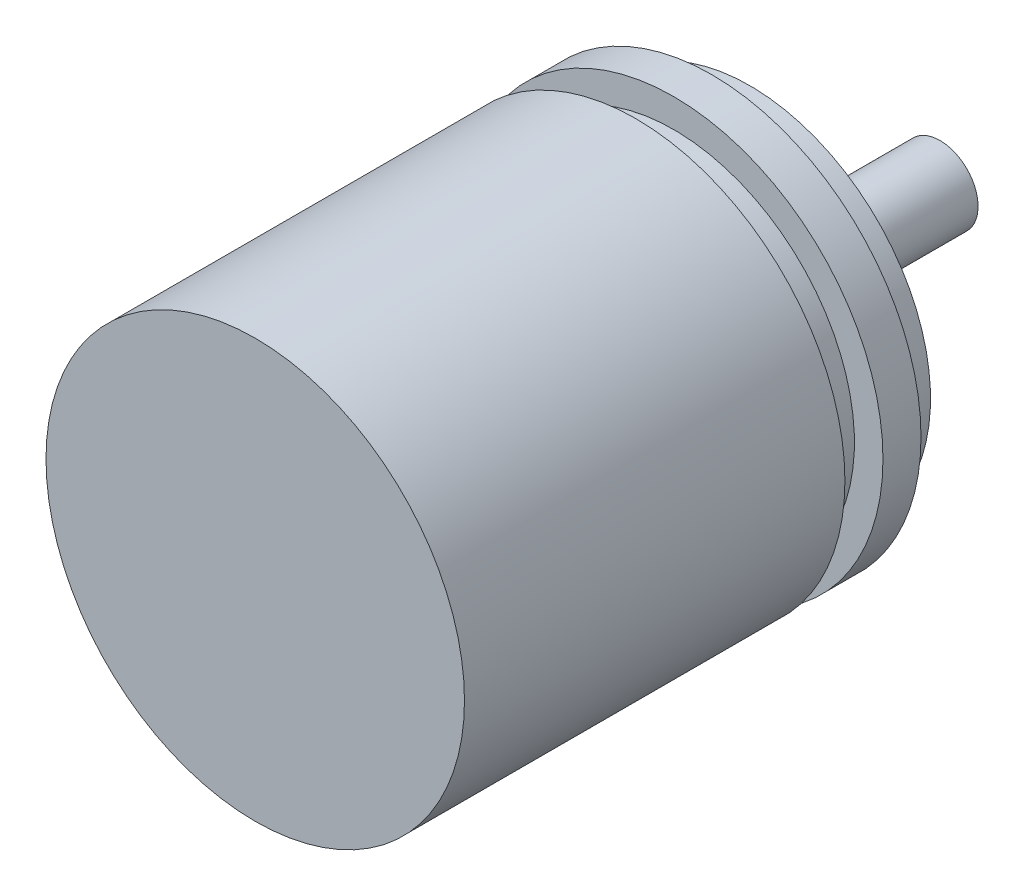
ISO-10303-21;
HEADER;
FILE_DESCRIPTION(('STEP AP214'),'2;1');
FILE_NAME('part.step','',(''),(''),'','','');
FILE_SCHEMA(('AUTOMOTIVE_DESIGN { 1 0 10303 214 1 1 1 1 }'));
ENDSEC;
DATA;
#1=APPLICATION_CONTEXT('core data for automotive mechanical design processes');
#2=APPLICATION_PROTOCOL_DEFINITION('international standard','automotive_design',2000,#1);
#3=PRODUCT_CONTEXT('',#1,'mechanical');
#4=PRODUCT('Part','Part','',(#3));
#5=PRODUCT_RELATED_PRODUCT_CATEGORY('part','',(#4));
#6=PRODUCT_DEFINITION_FORMATION('','',#4);
#7=PRODUCT_DEFINITION_CONTEXT('part definition',#1,'design');
#8=PRODUCT_DEFINITION('design','',#6,#7);
#9=PRODUCT_DEFINITION_SHAPE('','',#8);
#10=(LENGTH_UNIT() NAMED_UNIT(*) SI_UNIT(.MILLI.,.METRE.));
#11=(NAMED_UNIT(*) PLANE_ANGLE_UNIT() SI_UNIT($,.RADIAN.));
#12=(NAMED_UNIT(*) SI_UNIT($,.STERADIAN.) SOLID_ANGLE_UNIT());
#13=UNCERTAINTY_MEASURE_WITH_UNIT(LENGTH_MEASURE(1.E-05),#10,'distance_accuracy_value','');
#14=(GEOMETRIC_REPRESENTATION_CONTEXT(3) GLOBAL_UNCERTAINTY_ASSIGNED_CONTEXT((#13)) GLOBAL_UNIT_ASSIGNED_CONTEXT((#10,
#11,#12)) REPRESENTATION_CONTEXT('',''));
#15=CARTESIAN_POINT('',(0.,0.,0.));
#16=DIRECTION('',(0.,0.,1.));
#17=DIRECTION('',(1.,0.,0.));
#18=AXIS2_PLACEMENT_3D('',#15,#16,#17);
#19=CARTESIAN_POINT('',(0.,3.67761376907083E-13,13.9999999999999));
#20=DIRECTION('',(0.,0.,0.999999999999979));
#21=DIRECTION('',(1.,0.,0.));
#22=AXIS2_PLACEMENT_3D('',#19,#20,#21);
#23=PLANE('',#22);
#24=CARTESIAN_POINT('',(0.,3.67761376907083E-13,13.9999999999999));
#25=DIRECTION('',(0.,0.,0.999999999999979));
#26=DIRECTION('',(1.,0.,0.));
#27=AXIS2_PLACEMENT_3D('',#24,#25,#26);
#28=CIRCLE('',#27,11.);
#29=CARTESIAN_POINT('',(-11.,3.67761376907083E-13,13.9999999999999));
#30=VERTEX_POINT('',#29);
#31=EDGE_CURVE('E46',#30,#30,#28,.T.);
#32=ORIENTED_EDGE('',*,*,#31,.T.);
#33=EDGE_LOOP('',(#32));
#34=FACE_BOUND('',#33,.T.);
#35=CARTESIAN_POINT('',(0.,3.67761376907083E-13,13.9999999999999));
#36=DIRECTION('',(0.,0.,0.999999999999979));
#37=DIRECTION('',(1.,0.,0.));
#38=AXIS2_PLACEMENT_3D('',#35,#36,#37);
#39=CIRCLE('',#38,9.5);
#40=CARTESIAN_POINT('',(-9.5,3.81639164714898E-13,13.9999999999999));
#41=VERTEX_POINT('',#40);
#42=EDGE_CURVE('E55',#41,#41,#39,.T.);
#43=ORIENTED_EDGE('',*,*,#42,.F.);
#44=EDGE_LOOP('',(#43));
#45=FACE_BOUND('',#44,.T.);
#46=ADVANCED_FACE('F30',(#34,#45),#23,.T.);
#47=CARTESIAN_POINT('',(-6.66133814775094E-13,0.,9.99999999999991));
#48=DIRECTION('',(0.,0.,-0.999999999999979));
#49=DIRECTION('',(-1.,0.,0.));
#50=AXIS2_PLACEMENT_3D('',#47,#48,#49);
#51=CYLINDRICAL_SURFACE('',#50,2.);
#52=CARTESIAN_POINT('',(-6.66133814775094E-13,0.,9.99999999999991));
#53=DIRECTION('',(0.,0.,0.999999999999979));
#54=DIRECTION('',(1.,0.,0.));
#55=AXIS2_PLACEMENT_3D('',#52,#53,#54);
#56=CIRCLE('',#55,2.);
#57=CARTESIAN_POINT('',(-2.00000000000067,0.,9.99999999999991));
#58=VERTEX_POINT('',#57);
#59=EDGE_CURVE('E10',#58,#58,#56,.T.);
#60=CARTESIAN_POINT('',(0.,0.,0.));
#61=DIRECTION('',(0.,0.,0.999999999999979));
#62=DIRECTION('',(1.,0.,0.));
#63=AXIS2_PLACEMENT_3D('',#60,#61,#62);
#64=CIRCLE('',#63,2.);
#65=CARTESIAN_POINT('',(-2.00000000000067,0.,0.));
#66=VERTEX_POINT('',#65);
#67=EDGE_CURVE('E34',#66,#66,#64,.T.);
#68=CARTESIAN_POINT('',(-2.00000000000067,0.,9.99999999999991));
#69=CARTESIAN_POINT('',(-2.00000000000067,0.,9.89583333333325));
#70=CARTESIAN_POINT('',(-2.00000000000067,0.,9.79166666666658));
#71=CARTESIAN_POINT('',(-2.00000000000067,0.,9.58333333333325));
#72=CARTESIAN_POINT('',(-2.00000000000067,0.,9.47916666666658));
#73=CARTESIAN_POINT('',(-2.00000000000067,0.,9.27083333333325));
#74=CARTESIAN_POINT('',(-2.00000000000067,0.,9.16666666666658));
#75=CARTESIAN_POINT('',(-2.00000000000067,0.,8.95833333333325));
#76=CARTESIAN_POINT('',(-2.00000000000067,0.,8.85416666666659));
#77=CARTESIAN_POINT('',(-2.00000000000067,0.,8.64583333333326));
#78=CARTESIAN_POINT('',(-2.00000000000067,0.,8.54166666666659));
#79=CARTESIAN_POINT('',(-2.00000000000067,0.,8.33333333333326));
#80=CARTESIAN_POINT('',(-2.00000000000067,0.,8.22916666666659));
#81=CARTESIAN_POINT('',(-2.00000000000067,0.,8.02083333333326));
#82=CARTESIAN_POINT('',(-2.00000000000067,0.,7.9166666666666));
#83=CARTESIAN_POINT('',(-2.00000000000067,0.,7.70833333333326));
#84=CARTESIAN_POINT('',(-2.00000000000067,0.,7.6041666666666));
#85=CARTESIAN_POINT('',(-2.00000000000067,0.,7.39583333333327));
#86=CARTESIAN_POINT('',(-2.00000000000067,0.,7.2916666666666));
#87=CARTESIAN_POINT('',(-2.00000000000067,0.,7.08333333333327));
#88=CARTESIAN_POINT('',(-2.00000000000067,0.,6.9791666666666));
#89=CARTESIAN_POINT('',(-2.00000000000067,0.,6.77083333333327));
#90=CARTESIAN_POINT('',(-2.00000000000067,0.,6.66666666666661));
#91=CARTESIAN_POINT('',(-2.00000000000067,0.,6.45833333333328));
#92=CARTESIAN_POINT('',(-2.00000000000067,0.,6.35416666666661));
#93=CARTESIAN_POINT('',(-2.00000000000067,0.,6.14583333333328));
#94=CARTESIAN_POINT('',(-2.00000000000067,0.,6.04166666666661));
#95=CARTESIAN_POINT('',(-2.00000000000067,0.,5.83333333333328));
#96=CARTESIAN_POINT('',(-2.00000000000067,0.,5.72916666666662));
#97=CARTESIAN_POINT('',(-2.00000000000067,0.,5.52083333333329));
#98=CARTESIAN_POINT('',(-2.00000000000067,0.,5.41666666666662));
#99=CARTESIAN_POINT('',(-2.00000000000067,0.,5.20833333333329));
#100=CARTESIAN_POINT('',(-2.00000000000067,0.,5.10416666666662));
#101=CARTESIAN_POINT('',(-2.00000000000067,0.,4.89583333333329));
#102=CARTESIAN_POINT('',(-2.00000000000067,0.,4.79166666666662));
#103=CARTESIAN_POINT('',(-2.00000000000067,0.,4.58333333333329));
#104=CARTESIAN_POINT('',(-2.00000000000067,0.,4.47916666666663));
#105=CARTESIAN_POINT('',(-2.00000000000067,0.,4.2708333333333));
#106=CARTESIAN_POINT('',(-2.00000000000067,0.,4.16666666666663));
#107=CARTESIAN_POINT('',(-2.00000000000067,0.,3.9583333333333));
#108=CARTESIAN_POINT('',(-2.00000000000067,0.,3.85416666666663));
#109=CARTESIAN_POINT('',(-2.00000000000067,0.,3.6458333333333));
#110=CARTESIAN_POINT('',(-2.00000000000067,0.,3.54166666666664));
#111=CARTESIAN_POINT('',(-2.00000000000067,0.,3.3333333333333));
#112=CARTESIAN_POINT('',(-2.00000000000067,0.,3.22916666666664));
#113=CARTESIAN_POINT('',(-2.00000000000067,0.,3.02083333333331));
#114=CARTESIAN_POINT('',(-2.00000000000067,0.,2.91666666666664));
#115=CARTESIAN_POINT('',(-2.00000000000067,0.,2.70833333333331));
#116=CARTESIAN_POINT('',(-2.00000000000067,0.,2.60416666666664));
#117=CARTESIAN_POINT('',(-2.00000000000067,0.,2.39583333333331));
#118=CARTESIAN_POINT('',(-2.00000000000067,0.,2.29166666666665));
#119=CARTESIAN_POINT('',(-2.00000000000067,0.,2.08333333333332));
#120=CARTESIAN_POINT('',(-2.00000000000067,0.,1.97916666666665));
#121=CARTESIAN_POINT('',(-2.00000000000067,0.,1.77083333333332));
#122=CARTESIAN_POINT('',(-2.00000000000067,0.,1.66666666666665));
#123=CARTESIAN_POINT('',(-2.00000000000067,0.,1.45833333333332));
#124=CARTESIAN_POINT('',(-2.00000000000067,0.,1.35416666666666));
#125=CARTESIAN_POINT('',(-2.00000000000067,0.,1.14583333333332));
#126=CARTESIAN_POINT('',(-2.00000000000067,0.,1.04166666666666));
#127=CARTESIAN_POINT('',(-2.00000000000067,0.,0.833333333333327));
#128=CARTESIAN_POINT('',(-2.00000000000067,0.,0.729166666666661));
#129=CARTESIAN_POINT('',(-2.00000000000067,0.,0.52083333333333));
#130=CARTESIAN_POINT('',(-2.00000000000067,0.,0.416666666666664));
#131=CARTESIAN_POINT('',(-2.00000000000067,0.,0.208333333333332));
#132=CARTESIAN_POINT('',(-2.00000000000067,0.,0.104166666666666));
#133=CARTESIAN_POINT('',(-2.00000000000067,0.,0.));
#134=B_SPLINE_CURVE_WITH_KNOTS('',3,(#68,#69,#70,#71,#72,#73,#74,#75,#76,#77,#78,#79,#80,#81,
#82,#83,#84,#85,#86,#87,#88,#89,#90,#91,#92,#93,#94,#95,#96,#97,#98,#99,#100,#101,#102,#103,
#104,#105,#106,#107,#108,#109,#110,#111,#112,#113,#114,#115,#116,#117,#118,#119,#120,#121,#122,
#123,#124,#125,#126,#127,#128,#129,#130,#131,#132,#133),.UNSPECIFIED.,.F.,.F.,(4,2,2,2,2,2,2,2,
2,2,2,2,2,2,2,2,2,2,2,2,2,2,2,2,2,2,2,2,2,2,2,2,4),(0.,0.312499999999997,0.624999999999994,
0.93749999999999,1.24999999999999,1.56249999999999,1.87499999999998,2.18749999999998,
2.49999999999998,2.81249999999997,3.12499999999997,3.43749999999997,3.74999999999997,
4.06249999999996,4.37499999999996,4.68749999999996,4.99999999999995,5.31249999999995,
5.62499999999995,5.93749999999995,6.24999999999994,6.56249999999994,6.87499999999994,
7.18749999999993,7.49999999999993,7.81249999999993,8.12499999999993,8.43749999999992,
8.74999999999992,9.06249999999992,9.37499999999991,9.68749999999991,9.99999999999991),.UNSPECIFIED.);
#135=EDGE_CURVE('BSEAM32',#58,#66,#134,.T.);
#136=ORIENTED_EDGE('',*,*,#59,.F.);
#137=ORIENTED_EDGE('',*,*,#67,.T.);
#138=ORIENTED_EDGE('',*,*,#135,.T.);
#139=ORIENTED_EDGE('',*,*,#135,.F.);
#140=EDGE_LOOP('',(#136,#138,#137,#139));
#141=FACE_BOUND('',#140,.T.);
#142=ADVANCED_FACE('F32',(#141),#51,.T.);
#143=CARTESIAN_POINT('',(0.,0.,0.));
#144=DIRECTION('',(0.,0.,0.999999999999979));
#145=DIRECTION('',(1.,0.,0.));
#146=AXIS2_PLACEMENT_3D('',#143,#144,#145);
#147=PLANE('',#146);
#148=ORIENTED_EDGE('',*,*,#67,.F.);
#149=EDGE_LOOP('',(#148));
#150=FACE_BOUND('',#149,.T.);
#151=ADVANCED_FACE('F92',(#150),#147,.F.);
#152=CARTESIAN_POINT('',(-6.66133814775094E-13,0.,9.99999999999991));
#153=DIRECTION('',(0.,0.,0.999999999999979));
#154=DIRECTION('',(1.,0.,0.));
#155=AXIS2_PLACEMENT_3D('',#152,#153,#154);
#156=PLANE('',#155);
#157=CARTESIAN_POINT('',(-7.50000000000067,0.,9.99999999999991));
#158=DIRECTION('',(0.,0.,-0.999999999999979));
#159=DIRECTION('',(-1.,0.,0.));
#160=AXIS2_PLACEMENT_3D('',#157,#158,#159);
#161=CIRCLE('',#160,1.25);
#162=CARTESIAN_POINT('',(-8.75000000000001,0.,9.99999999999991));
#163=VERTEX_POINT('',#162);
#164=EDGE_CURVE('E73',#163,#163,#161,.T.);
#165=ORIENTED_EDGE('',*,*,#164,.F.);
#166=EDGE_LOOP('',(#165));
#167=FACE_BOUND('',#166,.T.);
#168=CARTESIAN_POINT('',(7.49999999999968,5.48172618408671E-13,9.99999999999994));
#169=DIRECTION('',(0.,0.,-0.999999999999979));
#170=DIRECTION('',(-1.,0.,0.));
#171=AXIS2_PLACEMENT_3D('',#168,#169,#170);
#172=CIRCLE('',#171,1.25);
#173=CARTESIAN_POINT('',(6.25000000000013,0.,9.99999999999994));
#174=VERTEX_POINT('',#173);
#175=EDGE_CURVE('E67',#174,#174,#172,.T.);
#176=ORIENTED_EDGE('',*,*,#175,.F.);
#177=EDGE_LOOP('',(#176));
#178=FACE_BOUND('',#177,.T.);
#179=CARTESIAN_POINT('',(-6.66133814775094E-13,0.,9.99999999999991));
#180=DIRECTION('',(0.,0.,0.999999999999979));
#181=DIRECTION('',(1.,0.,0.));
#182=AXIS2_PLACEMENT_3D('',#179,#180,#181);
#183=CIRCLE('',#182,9.5);
#184=CARTESIAN_POINT('',(-9.50000000000067,0.,9.99999999999991));
#185=VERTEX_POINT('',#184);
#186=EDGE_CURVE('E43',#185,#185,#183,.T.);
#187=ORIENTED_EDGE('',*,*,#186,.F.);
#188=EDGE_LOOP('',(#187));
#189=FACE_BOUND('',#188,.T.);
#190=ORIENTED_EDGE('',*,*,#59,.T.);
#191=EDGE_LOOP('',(#190));
#192=FACE_BOUND('',#191,.T.);
#193=ADVANCED_FACE('F88',(#167,#178,#189,#192),#156,.F.);
#194=CARTESIAN_POINT('',(-6.66133814775094E-13,0.,11.9999999999999));
#195=DIRECTION('',(0.,0.,-0.999999999999979));
#196=DIRECTION('',(-1.,0.,0.));
#197=AXIS2_PLACEMENT_3D('',#194,#195,#196);
#198=CYLINDRICAL_SURFACE('',#197,9.5);
#199=CARTESIAN_POINT('',(-6.66133814775094E-13,0.,11.9999999999999));
#200=DIRECTION('',(0.,0.,0.999999999999979));
#201=DIRECTION('',(1.,0.,0.));
#202=AXIS2_PLACEMENT_3D('',#199,#200,#201);
#203=CIRCLE('',#202,9.5);
#204=CARTESIAN_POINT('',(-9.50000000000067,0.,11.9999999999999));
#205=VERTEX_POINT('',#204);
#206=EDGE_CURVE('E41',#205,#205,#203,.T.);
#207=CARTESIAN_POINT('',(-9.50000000000067,0.,11.9999999999999));
#208=CARTESIAN_POINT('',(-9.50000000000067,0.,11.9791666666666));
#209=CARTESIAN_POINT('',(-9.50000000000067,0.,11.9583333333332));
#210=CARTESIAN_POINT('',(-9.50000000000067,0.,11.9166666666666));
#211=CARTESIAN_POINT('',(-9.50000000000067,0.,11.8958333333332));
#212=CARTESIAN_POINT('',(-9.50000000000067,0.,11.8541666666666));
#213=CARTESIAN_POINT('',(-9.50000000000067,0.,11.8333333333332));
#214=CARTESIAN_POINT('',(-9.50000000000067,0.,11.7916666666666));
#215=CARTESIAN_POINT('',(-9.50000000000067,0.,11.7708333333332));
#216=CARTESIAN_POINT('',(-9.50000000000067,0.,11.7291666666666));
#217=CARTESIAN_POINT('',(-9.50000000000067,0.,11.7083333333332));
#218=CARTESIAN_POINT('',(-9.50000000000067,0.,11.6666666666666));
#219=CARTESIAN_POINT('',(-9.50000000000067,0.,11.6458333333332));
#220=CARTESIAN_POINT('',(-9.50000000000067,0.,11.6041666666666));
#221=CARTESIAN_POINT('',(-9.50000000000067,0.,11.5833333333332));
#222=CARTESIAN_POINT('',(-9.50000000000067,0.,11.5416666666666));
#223=CARTESIAN_POINT('',(-9.50000000000067,0.,11.5208333333332));
#224=CARTESIAN_POINT('',(-9.50000000000067,0.,11.4791666666666));
#225=CARTESIAN_POINT('',(-9.50000000000067,0.,11.4583333333332));
#226=CARTESIAN_POINT('',(-9.50000000000067,0.,11.4166666666666));
#227=CARTESIAN_POINT('',(-9.50000000000067,0.,11.3958333333332));
#228=CARTESIAN_POINT('',(-9.50000000000067,0.,11.3541666666666));
#229=CARTESIAN_POINT('',(-9.50000000000067,0.,11.3333333333332));
#230=CARTESIAN_POINT('',(-9.50000000000067,0.,11.2916666666666));
#231=CARTESIAN_POINT('',(-9.50000000000067,0.,11.2708333333332));
#232=CARTESIAN_POINT('',(-9.50000000000067,0.,11.2291666666666));
#233=CARTESIAN_POINT('',(-9.50000000000067,0.,11.2083333333332));
#234=CARTESIAN_POINT('',(-9.50000000000067,0.,11.1666666666666));
#235=CARTESIAN_POINT('',(-9.50000000000067,0.,11.1458333333332));
#236=CARTESIAN_POINT('',(-9.50000000000067,0.,11.1041666666666));
#237=CARTESIAN_POINT('',(-9.50000000000067,0.,11.0833333333332));
#238=CARTESIAN_POINT('',(-9.50000000000067,0.,11.0416666666666));
#239=CARTESIAN_POINT('',(-9.50000000000067,0.,11.0208333333332));
#240=CARTESIAN_POINT('',(-9.50000000000067,0.,10.9791666666666));
#241=CARTESIAN_POINT('',(-9.50000000000067,0.,10.9583333333332));
#242=CARTESIAN_POINT('',(-9.50000000000067,0.,10.9166666666666));
#243=CARTESIAN_POINT('',(-9.50000000000067,0.,10.8958333333332));
#244=CARTESIAN_POINT('',(-9.50000000000067,0.,10.8541666666666));
#245=CARTESIAN_POINT('',(-9.50000000000067,0.,10.8333333333332));
#246=CARTESIAN_POINT('',(-9.50000000000067,0.,10.7916666666666));
#247=CARTESIAN_POINT('',(-9.50000000000067,0.,10.7708333333332));
#248=CARTESIAN_POINT('',(-9.50000000000067,0.,10.7291666666666));
#249=CARTESIAN_POINT('',(-9.50000000000067,0.,10.7083333333332));
#250=CARTESIAN_POINT('',(-9.50000000000067,0.,10.6666666666666));
#251=CARTESIAN_POINT('',(-9.50000000000067,0.,10.6458333333332));
#252=CARTESIAN_POINT('',(-9.50000000000067,0.,10.6041666666666));
#253=CARTESIAN_POINT('',(-9.50000000000067,0.,10.5833333333332));
#254=CARTESIAN_POINT('',(-9.50000000000067,0.,10.5416666666666));
#255=CARTESIAN_POINT('',(-9.50000000000067,0.,10.5208333333332));
#256=CARTESIAN_POINT('',(-9.50000000000067,0.,10.4791666666666));
#257=CARTESIAN_POINT('',(-9.50000000000067,0.,10.4583333333332));
#258=CARTESIAN_POINT('',(-9.50000000000067,0.,10.4166666666666));
#259=CARTESIAN_POINT('',(-9.50000000000067,0.,10.3958333333332));
#260=CARTESIAN_POINT('',(-9.50000000000067,0.,10.3541666666666));
#261=CARTESIAN_POINT('',(-9.50000000000067,0.,10.3333333333332));
#262=CARTESIAN_POINT('',(-9.50000000000067,0.,10.2916666666666));
#263=CARTESIAN_POINT('',(-9.50000000000067,0.,10.2708333333332));
#264=CARTESIAN_POINT('',(-9.50000000000067,0.,10.2291666666666));
#265=CARTESIAN_POINT('',(-9.50000000000067,0.,10.2083333333332));
#266=CARTESIAN_POINT('',(-9.50000000000067,0.,10.1666666666666));
#267=CARTESIAN_POINT('',(-9.50000000000067,0.,10.1458333333332));
#268=CARTESIAN_POINT('',(-9.50000000000067,0.,10.1041666666666));
#269=CARTESIAN_POINT('',(-9.50000000000067,0.,10.0833333333332));
#270=CARTESIAN_POINT('',(-9.50000000000067,0.,10.0416666666666));
#271=CARTESIAN_POINT('',(-9.50000000000067,0.,10.0208333333332));
#272=CARTESIAN_POINT('',(-9.50000000000067,0.,9.99999999999991));
#273=B_SPLINE_CURVE_WITH_KNOTS('',3,(#207,#208,#209,#210,#211,#212,#213,#214,#215,#216,#217,
#218,#219,#220,#221,#222,#223,#224,#225,#226,#227,#228,#229,#230,#231,#232,#233,#234,#235,#236,
#237,#238,#239,#240,#241,#242,#243,#244,#245,#246,#247,#248,#249,#250,#251,#252,#253,#254,#255,
#256,#257,#258,#259,#260,#261,#262,#263,#264,#265,#266,#267,#268,#269,#270,#271,#272),
.UNSPECIFIED.,.F.,.F.,(4,2,2,2,2,2,2,2,2,2,2,2,2,2,2,2,2,2,2,2,2,2,2,2,2,2,2,2,2,2,2,2,4),(0.,
0.0624999999999983,0.124999999999998,0.187499999999998,0.249999999999999,0.312499999999999,
0.374999999999999,0.437499999999999,0.499999999999999,0.562499999999999,0.624999999999999,
0.687499999999999,0.749999999999999,0.812499999999999,0.874999999999999,0.937499999999999,
0.999999999999999,1.0625,1.125,1.1875,1.25,1.3125,1.375,1.4375,1.5,1.5625,1.625,1.6875,1.75,
1.8125,1.875,1.9375,2.),.UNSPECIFIED.);
#274=EDGE_CURVE('BSEAM91',#205,#185,#273,.T.);
#275=ORIENTED_EDGE('',*,*,#206,.F.);
#276=ORIENTED_EDGE('',*,*,#186,.T.);
#277=ORIENTED_EDGE('',*,*,#274,.T.);
#278=ORIENTED_EDGE('',*,*,#274,.F.);
#279=EDGE_LOOP('',(#275,#277,#276,#278));
#280=FACE_BOUND('',#279,.T.);
#281=ADVANCED_FACE('F91',(#280),#198,.T.);
#282=CARTESIAN_POINT('',(-6.66133814775094E-13,0.,11.9999999999999));
#283=DIRECTION('',(0.,0.,0.999999999999979));
#284=DIRECTION('',(1.,0.,0.));
#285=AXIS2_PLACEMENT_3D('',#282,#283,#284);
#286=PLANE('',#285);
#287=CARTESIAN_POINT('',(-6.66133814775094E-13,0.,11.9999999999999));
#288=DIRECTION('',(0.,0.,0.999999999999979));
#289=DIRECTION('',(1.,0.,0.));
#290=AXIS2_PLACEMENT_3D('',#287,#288,#289);
#291=CIRCLE('',#290,11.);
#292=CARTESIAN_POINT('',(-11.,3.67761376907083E-13,11.9999999999999));
#293=VERTEX_POINT('',#292);
#294=EDGE_CURVE('E49',#293,#293,#291,.T.);
#295=ORIENTED_EDGE('',*,*,#294,.F.);
#296=EDGE_LOOP('',(#295));
#297=FACE_BOUND('',#296,.T.);
#298=ORIENTED_EDGE('',*,*,#206,.T.);
#299=EDGE_LOOP('',(#298));
#300=FACE_BOUND('',#299,.T.);
#301=ADVANCED_FACE('F99',(#297,#300),#286,.F.);
#302=CARTESIAN_POINT('',(0.,3.67761376907083E-13,13.9999999999999));
#303=DIRECTION('',(0.,0.,-0.999999999999979));
#304=DIRECTION('',(-1.,0.,0.));
#305=AXIS2_PLACEMENT_3D('',#302,#303,#304);
#306=CYLINDRICAL_SURFACE('',#305,11.);
#307=CARTESIAN_POINT('',(-11.,3.67761376907083E-13,13.9999999999999));
#308=CARTESIAN_POINT('',(-11.,3.67761376907083E-13,13.9791666666666));
#309=CARTESIAN_POINT('',(-11.,3.67761376907083E-13,13.9583333333332));
#310=CARTESIAN_POINT('',(-11.,3.67761376907083E-13,13.9166666666666));
#311=CARTESIAN_POINT('',(-11.,3.67761376907083E-13,13.8958333333332));
#312=CARTESIAN_POINT('',(-11.,3.67761376907083E-13,13.8541666666666));
#313=CARTESIAN_POINT('',(-11.,3.67761376907083E-13,13.8333333333332));
#314=CARTESIAN_POINT('',(-11.,3.67761376907083E-13,13.7916666666666));
#315=CARTESIAN_POINT('',(-11.,3.67761376907083E-13,13.7708333333332));
#316=CARTESIAN_POINT('',(-11.,3.67761376907083E-13,13.7291666666666));
#317=CARTESIAN_POINT('',(-11.,3.67761376907083E-13,13.7083333333332));
#318=CARTESIAN_POINT('',(-11.,3.67761376907083E-13,13.6666666666666));
#319=CARTESIAN_POINT('',(-11.,3.67761376907083E-13,13.6458333333332));
#320=CARTESIAN_POINT('',(-11.,3.67761376907083E-13,13.6041666666666));
#321=CARTESIAN_POINT('',(-11.,3.67761376907083E-13,13.5833333333332));
#322=CARTESIAN_POINT('',(-11.,3.67761376907083E-13,13.5416666666666));
#323=CARTESIAN_POINT('',(-11.,3.67761376907083E-13,13.5208333333332));
#324=CARTESIAN_POINT('',(-11.,3.67761376907083E-13,13.4791666666666));
#325=CARTESIAN_POINT('',(-11.,3.67761376907083E-13,13.4583333333332));
#326=CARTESIAN_POINT('',(-11.,3.67761376907083E-13,13.4166666666666));
#327=CARTESIAN_POINT('',(-11.,3.67761376907083E-13,13.3958333333332));
#328=CARTESIAN_POINT('',(-11.,3.67761376907083E-13,13.3541666666666));
#329=CARTESIAN_POINT('',(-11.,3.67761376907083E-13,13.3333333333332));
#330=CARTESIAN_POINT('',(-11.,3.67761376907083E-13,13.2916666666666));
#331=CARTESIAN_POINT('',(-11.,3.67761376907083E-13,13.2708333333332));
#332=CARTESIAN_POINT('',(-11.,3.67761376907083E-13,13.2291666666666));
#333=CARTESIAN_POINT('',(-11.,3.67761376907083E-13,13.2083333333332));
#334=CARTESIAN_POINT('',(-11.,3.67761376907083E-13,13.1666666666666));
#335=CARTESIAN_POINT('',(-11.,3.67761376907083E-13,13.1458333333332));
#336=CARTESIAN_POINT('',(-11.,3.67761376907083E-13,13.1041666666666));
#337=CARTESIAN_POINT('',(-11.,3.67761376907083E-13,13.0833333333332));
#338=CARTESIAN_POINT('',(-11.,3.67761376907083E-13,13.0416666666666));
#339=CARTESIAN_POINT('',(-11.,3.67761376907083E-13,13.0208333333332));
#340=CARTESIAN_POINT('',(-11.,3.67761376907083E-13,12.9791666666666));
#341=CARTESIAN_POINT('',(-11.,3.67761376907083E-13,12.9583333333332));
#342=CARTESIAN_POINT('',(-11.,3.67761376907083E-13,12.9166666666666));
#343=CARTESIAN_POINT('',(-11.,3.67761376907083E-13,12.8958333333332));
#344=CARTESIAN_POINT('',(-11.,3.67761376907083E-13,12.8541666666666));
#345=CARTESIAN_POINT('',(-11.,3.67761376907083E-13,12.8333333333332));
#346=CARTESIAN_POINT('',(-11.,3.67761376907083E-13,12.7916666666666));
#347=CARTESIAN_POINT('',(-11.,3.67761376907083E-13,12.7708333333332));
#348=CARTESIAN_POINT('',(-11.,3.67761376907083E-13,12.7291666666666));
#349=CARTESIAN_POINT('',(-11.,3.67761376907083E-13,12.7083333333332));
#350=CARTESIAN_POINT('',(-11.,3.67761376907083E-13,12.6666666666666));
#351=CARTESIAN_POINT('',(-11.,3.67761376907083E-13,12.6458333333332));
#352=CARTESIAN_POINT('',(-11.,3.67761376907083E-13,12.6041666666666));
#353=CARTESIAN_POINT('',(-11.,3.67761376907083E-13,12.5833333333332));
#354=CARTESIAN_POINT('',(-11.,3.67761376907083E-13,12.5416666666666));
#355=CARTESIAN_POINT('',(-11.,3.67761376907083E-13,12.5208333333332));
#356=CARTESIAN_POINT('',(-11.,3.67761376907083E-13,12.4791666666666));
#357=CARTESIAN_POINT('',(-11.,3.67761376907083E-13,12.4583333333332));
#358=CARTESIAN_POINT('',(-11.,3.67761376907083E-13,12.4166666666666));
#359=CARTESIAN_POINT('',(-11.,3.67761376907083E-13,12.3958333333332));
#360=CARTESIAN_POINT('',(-11.,3.67761376907083E-13,12.3541666666666));
#361=CARTESIAN_POINT('',(-11.,3.67761376907083E-13,12.3333333333332));
#362=CARTESIAN_POINT('',(-11.,3.67761376907083E-13,12.2916666666666));
#363=CARTESIAN_POINT('',(-11.,3.67761376907083E-13,12.2708333333332));
#364=CARTESIAN_POINT('',(-11.,3.67761376907083E-13,12.2291666666666));
#365=CARTESIAN_POINT('',(-11.,3.67761376907083E-13,12.2083333333332));
#366=CARTESIAN_POINT('',(-11.,3.67761376907083E-13,12.1666666666666));
#367=CARTESIAN_POINT('',(-11.,3.67761376907083E-13,12.1458333333332));
#368=CARTESIAN_POINT('',(-11.,3.67761376907083E-13,12.1041666666666));
#369=CARTESIAN_POINT('',(-11.,3.67761376907083E-13,12.0833333333332));
#370=CARTESIAN_POINT('',(-11.,3.67761376907083E-13,12.0416666666666));
#371=CARTESIAN_POINT('',(-11.,3.67761376907083E-13,12.0208333333332));
#372=CARTESIAN_POINT('',(-11.,3.67761376907083E-13,11.9999999999999));
#373=B_SPLINE_CURVE_WITH_KNOTS('',3,(#307,#308,#309,#310,#311,#312,#313,#314,#315,#316,#317,
#318,#319,#320,#321,#322,#323,#324,#325,#326,#327,#328,#329,#330,#331,#332,#333,#334,#335,#336,
#337,#338,#339,#340,#341,#342,#343,#344,#345,#346,#347,#348,#349,#350,#351,#352,#353,#354,#355,
#356,#357,#358,#359,#360,#361,#362,#363,#364,#365,#366,#367,#368,#369,#370,#371,#372),
.UNSPECIFIED.,.F.,.F.,(4,2,2,2,2,2,2,2,2,2,2,2,2,2,2,2,2,2,2,2,2,2,2,2,2,2,2,2,2,2,2,2,4),(0.,
0.0624999999999983,0.124999999999998,0.187499999999998,0.249999999999999,0.312499999999999,
0.374999999999999,0.437499999999999,0.499999999999999,0.562499999999999,0.624999999999999,
0.687499999999999,0.749999999999999,0.812499999999999,0.874999999999999,0.937499999999999,
0.999999999999999,1.0625,1.125,1.1875,1.25,1.3125,1.375,1.4375,1.5,1.5625,1.625,1.6875,1.75,
1.8125,1.875,1.9375,2.),.UNSPECIFIED.);
#374=EDGE_CURVE('BSEAM105',#30,#293,#373,.T.);
#375=ORIENTED_EDGE('',*,*,#31,.F.);
#376=ORIENTED_EDGE('',*,*,#294,.T.);
#377=ORIENTED_EDGE('',*,*,#374,.T.);
#378=ORIENTED_EDGE('',*,*,#374,.F.);
#379=EDGE_LOOP('',(#375,#377,#376,#378));
#380=FACE_BOUND('',#379,.T.);
#381=ADVANCED_FACE('F105',(#380),#306,.T.);
#382=CARTESIAN_POINT('',(0.,3.81639164714898E-13,15.9999999999997));
#383=DIRECTION('',(0.,0.,-0.999999999999979));
#384=DIRECTION('',(-1.,0.,0.));
#385=AXIS2_PLACEMENT_3D('',#382,#383,#384);
#386=CYLINDRICAL_SURFACE('',#385,9.5);
#387=CARTESIAN_POINT('',(0.,3.81639164714898E-13,15.9999999999997));
#388=DIRECTION('',(0.,0.,0.999999999999979));
#389=DIRECTION('',(1.,0.,0.));
#390=AXIS2_PLACEMENT_3D('',#387,#388,#389);
#391=CIRCLE('',#390,9.5);
#392=CARTESIAN_POINT('',(-9.5,3.81639164714898E-13,15.9999999999997));
#393=VERTEX_POINT('',#392);
#394=EDGE_CURVE('E52',#393,#393,#391,.T.);
#395=CARTESIAN_POINT('',(-9.5,3.81639164714898E-13,15.9999999999997));
#396=CARTESIAN_POINT('',(-9.5,3.81639164714898E-13,15.9791666666664));
#397=CARTESIAN_POINT('',(-9.5,3.81639164714898E-13,15.958333333333));
#398=CARTESIAN_POINT('',(-9.5,3.81639164714898E-13,15.9166666666664));
#399=CARTESIAN_POINT('',(-9.5,3.81639164714898E-13,15.895833333333));
#400=CARTESIAN_POINT('',(-9.5,3.81639164714898E-13,15.8541666666664));
#401=CARTESIAN_POINT('',(-9.5,3.81639164714898E-13,15.8333333333331));
#402=CARTESIAN_POINT('',(-9.5,3.81639164714898E-13,15.7916666666664));
#403=CARTESIAN_POINT('',(-9.5,3.81639164714898E-13,15.7708333333331));
#404=CARTESIAN_POINT('',(-9.5,3.81639164714898E-13,15.7291666666664));
#405=CARTESIAN_POINT('',(-9.5,3.81639164714898E-13,15.7083333333331));
#406=CARTESIAN_POINT('',(-9.5,3.81639164714898E-13,15.6666666666664));
#407=CARTESIAN_POINT('',(-9.5,3.81639164714898E-13,15.6458333333331));
#408=CARTESIAN_POINT('',(-9.5,3.81639164714898E-13,15.6041666666664));
#409=CARTESIAN_POINT('',(-9.5,3.81639164714898E-13,15.5833333333331));
#410=CARTESIAN_POINT('',(-9.5,3.81639164714898E-13,15.5416666666664));
#411=CARTESIAN_POINT('',(-9.5,3.81639164714898E-13,15.5208333333331));
#412=CARTESIAN_POINT('',(-9.5,3.81639164714898E-13,15.4791666666664));
#413=CARTESIAN_POINT('',(-9.5,3.81639164714898E-13,15.4583333333331));
#414=CARTESIAN_POINT('',(-9.5,3.81639164714898E-13,15.4166666666664));
#415=CARTESIAN_POINT('',(-9.5,3.81639164714898E-13,15.3958333333331));
#416=CARTESIAN_POINT('',(-9.5,3.81639164714898E-13,15.3541666666664));
#417=CARTESIAN_POINT('',(-9.5,3.81639164714898E-13,15.3333333333331));
#418=CARTESIAN_POINT('',(-9.5,3.81639164714898E-13,15.2916666666664));
#419=CARTESIAN_POINT('',(-9.5,3.81639164714898E-13,15.2708333333331));
#420=CARTESIAN_POINT('',(-9.5,3.81639164714898E-13,15.2291666666665));
#421=CARTESIAN_POINT('',(-9.5,3.81639164714898E-13,15.2083333333331));
#422=CARTESIAN_POINT('',(-9.5,3.81639164714898E-13,15.1666666666665));
#423=CARTESIAN_POINT('',(-9.5,3.81639164714898E-13,15.1458333333331));
#424=CARTESIAN_POINT('',(-9.5,3.81639164714898E-13,15.1041666666665));
#425=CARTESIAN_POINT('',(-9.5,3.81639164714898E-13,15.0833333333331));
#426=CARTESIAN_POINT('',(-9.5,3.81639164714898E-13,15.0416666666665));
#427=CARTESIAN_POINT('',(-9.5,3.81639164714898E-13,15.0208333333331));
#428=CARTESIAN_POINT('',(-9.5,3.81639164714898E-13,14.9791666666665));
#429=CARTESIAN_POINT('',(-9.5,3.81639164714898E-13,14.9583333333331));
#430=CARTESIAN_POINT('',(-9.5,3.81639164714898E-13,14.9166666666665));
#431=CARTESIAN_POINT('',(-9.5,3.81639164714898E-13,14.8958333333332));
#432=CARTESIAN_POINT('',(-9.5,3.81639164714898E-13,14.8541666666665));
#433=CARTESIAN_POINT('',(-9.5,3.81639164714898E-13,14.8333333333332));
#434=CARTESIAN_POINT('',(-9.5,3.81639164714898E-13,14.7916666666665));
#435=CARTESIAN_POINT('',(-9.5,3.81639164714898E-13,14.7708333333332));
#436=CARTESIAN_POINT('',(-9.5,3.81639164714898E-13,14.7291666666665));
#437=CARTESIAN_POINT('',(-9.5,3.81639164714898E-13,14.7083333333332));
#438=CARTESIAN_POINT('',(-9.5,3.81639164714898E-13,14.6666666666665));
#439=CARTESIAN_POINT('',(-9.5,3.81639164714898E-13,14.6458333333332));
#440=CARTESIAN_POINT('',(-9.5,3.81639164714898E-13,14.6041666666665));
#441=CARTESIAN_POINT('',(-9.5,3.81639164714898E-13,14.5833333333332));
#442=CARTESIAN_POINT('',(-9.5,3.81639164714898E-13,14.5416666666665));
#443=CARTESIAN_POINT('',(-9.5,3.81639164714898E-13,14.5208333333332));
#444=CARTESIAN_POINT('',(-9.5,3.81639164714898E-13,14.4791666666665));
#445=CARTESIAN_POINT('',(-9.5,3.81639164714898E-13,14.4583333333332));
#446=CARTESIAN_POINT('',(-9.5,3.81639164714898E-13,14.4166666666665));
#447=CARTESIAN_POINT('',(-9.5,3.81639164714898E-13,14.3958333333332));
#448=CARTESIAN_POINT('',(-9.5,3.81639164714898E-13,14.3541666666665));
#449=CARTESIAN_POINT('',(-9.5,3.81639164714898E-13,14.3333333333332));
#450=CARTESIAN_POINT('',(-9.5,3.81639164714898E-13,14.2916666666666));
#451=CARTESIAN_POINT('',(-9.5,3.81639164714898E-13,14.2708333333332));
#452=CARTESIAN_POINT('',(-9.5,3.81639164714898E-13,14.2291666666666));
#453=CARTESIAN_POINT('',(-9.5,3.81639164714898E-13,14.2083333333332));
#454=CARTESIAN_POINT('',(-9.5,3.81639164714898E-13,14.1666666666666));
#455=CARTESIAN_POINT('',(-9.5,3.81639164714898E-13,14.1458333333332));
#456=CARTESIAN_POINT('',(-9.5,3.81639164714898E-13,14.1041666666666));
#457=CARTESIAN_POINT('',(-9.5,3.81639164714898E-13,14.0833333333332));
#458=CARTESIAN_POINT('',(-9.5,3.81639164714898E-13,14.0416666666666));
#459=CARTESIAN_POINT('',(-9.5,3.81639164714898E-13,14.0208333333332));
#460=CARTESIAN_POINT('',(-9.5,3.81639164714898E-13,13.9999999999999));
#461=B_SPLINE_CURVE_WITH_KNOTS('',3,(#395,#396,#397,#398,#399,#400,#401,#402,#403,#404,#405,
#406,#407,#408,#409,#410,#411,#412,#413,#414,#415,#416,#417,#418,#419,#420,#421,#422,#423,#424,
#425,#426,#427,#428,#429,#430,#431,#432,#433,#434,#435,#436,#437,#438,#439,#440,#441,#442,#443,
#444,#445,#446,#447,#448,#449,#450,#451,#452,#453,#454,#455,#456,#457,#458,#459,#460),
.UNSPECIFIED.,.F.,.F.,(4,2,2,2,2,2,2,2,2,2,2,2,2,2,2,2,2,2,2,2,2,2,2,2,2,2,2,2,2,2,2,2,4),(0.,
0.0624999999999966,0.12499999999999,0.187499999999983,0.249999999999976,0.312499999999969,
0.374999999999962,0.437499999999957,0.49999999999995,0.562499999999943,0.624999999999936,
0.687499999999931,0.749999999999924,0.812499999999917,0.874999999999911,0.937499999999904,
0.999999999999899,1.06249999999989,1.12499999999988,1.18749999999988,1.24999999999987,
1.31249999999987,1.37499999999986,1.43749999999985,1.49999999999985,1.56249999999984,
1.62499999999983,1.68749999999983,1.74999999999982,1.81249999999981,1.87499999999981,
1.9374999999998,1.99999999999979),.UNSPECIFIED.);
#462=EDGE_CURVE('BSEAM118',#393,#41,#461,.T.);
#463=ORIENTED_EDGE('',*,*,#394,.F.);
#464=ORIENTED_EDGE('',*,*,#42,.T.);
#465=ORIENTED_EDGE('',*,*,#462,.T.);
#466=ORIENTED_EDGE('',*,*,#462,.F.);
#467=EDGE_LOOP('',(#463,#465,#464,#466));
#468=FACE_BOUND('',#467,.T.);
#469=ADVANCED_FACE('F118',(#468),#386,.T.);
#470=CARTESIAN_POINT('',(0.,3.81639164714898E-13,15.9999999999997));
#471=DIRECTION('',(0.,0.,0.999999999999979));
#472=DIRECTION('',(1.,0.,0.));
#473=AXIS2_PLACEMENT_3D('',#470,#471,#472);
#474=PLANE('',#473);
#475=CARTESIAN_POINT('',(0.,3.81639164714898E-13,15.9999999999997));
#476=DIRECTION('',(0.,0.,0.999999999999979));
#477=DIRECTION('',(1.,0.,0.));
#478=AXIS2_PLACEMENT_3D('',#475,#476,#477);
#479=CIRCLE('',#478,11.);
#480=CARTESIAN_POINT('',(-10.999999999999,0.,15.9999999999997));
#481=VERTEX_POINT('',#480);
#482=EDGE_CURVE('E61',#481,#481,#479,.T.);
#483=ORIENTED_EDGE('',*,*,#482,.F.);
#484=EDGE_LOOP('',(#483));
#485=FACE_BOUND('',#484,.T.);
#486=ORIENTED_EDGE('',*,*,#394,.T.);
#487=EDGE_LOOP('',(#486));
#488=FACE_BOUND('',#487,.T.);
#489=ADVANCED_FACE('F126',(#485,#488),#474,.F.);
#490=CARTESIAN_POINT('',(9.54097911787244E-13,0.,35.9999999999992));
#491=DIRECTION('',(0.,0.,-0.999999999999979));
#492=DIRECTION('',(-1.,0.,0.));
#493=AXIS2_PLACEMENT_3D('',#490,#491,#492);
#494=CYLINDRICAL_SURFACE('',#493,11.);
#495=CARTESIAN_POINT('',(9.54097911787244E-13,0.,35.9999999999992));
#496=DIRECTION('',(0.,0.,0.999999999999979));
#497=DIRECTION('',(1.,0.,0.));
#498=AXIS2_PLACEMENT_3D('',#495,#496,#497);
#499=CIRCLE('',#498,11.);
#500=CARTESIAN_POINT('',(-10.999999999999,0.,35.9999999999991));
#501=VERTEX_POINT('',#500);
#502=EDGE_CURVE('E58',#501,#501,#499,.T.);
#503=CARTESIAN_POINT('',(-10.999999999999,0.,35.9999999999991));
#504=CARTESIAN_POINT('',(-10.999999999999,0.,35.7916666666658));
#505=CARTESIAN_POINT('',(-10.999999999999,0.,35.5833333333325));
#506=CARTESIAN_POINT('',(-10.999999999999,0.,35.1666666666658));
#507=CARTESIAN_POINT('',(-10.999999999999,0.,34.9583333333325));
#508=CARTESIAN_POINT('',(-10.999999999999,0.,34.5416666666659));
#509=CARTESIAN_POINT('',(-10.999999999999,0.,34.3333333333325));
#510=CARTESIAN_POINT('',(-10.999999999999,0.,33.9166666666659));
#511=CARTESIAN_POINT('',(-10.999999999999,0.,33.7083333333325));
#512=CARTESIAN_POINT('',(-10.999999999999,0.,33.2916666666659));
#513=CARTESIAN_POINT('',(-10.999999999999,0.,33.0833333333326));
#514=CARTESIAN_POINT('',(-10.999999999999,0.,32.6666666666659));
#515=CARTESIAN_POINT('',(-10.999999999999,0.,32.4583333333326));
#516=CARTESIAN_POINT('',(-10.999999999999,0.,32.0416666666659));
#517=CARTESIAN_POINT('',(-10.999999999999,0.,31.8333333333326));
#518=CARTESIAN_POINT('',(-10.999999999999,0.,31.4166666666659));
#519=CARTESIAN_POINT('',(-10.999999999999,0.,31.2083333333326));
#520=CARTESIAN_POINT('',(-10.999999999999,0.,30.791666666666));
#521=CARTESIAN_POINT('',(-10.999999999999,0.,30.5833333333326));
#522=CARTESIAN_POINT('',(-10.999999999999,0.,30.166666666666));
#523=CARTESIAN_POINT('',(-10.999999999999,0.,29.9583333333327));
#524=CARTESIAN_POINT('',(-10.999999999999,0.,29.541666666666));
#525=CARTESIAN_POINT('',(-10.999999999999,0.,29.3333333333327));
#526=CARTESIAN_POINT('',(-10.999999999999,0.,28.916666666666));
#527=CARTESIAN_POINT('',(-10.999999999999,0.,28.7083333333327));
#528=CARTESIAN_POINT('',(-10.999999999999,0.,28.291666666666));
#529=CARTESIAN_POINT('',(-10.999999999999,0.,28.0833333333327));
#530=CARTESIAN_POINT('',(-10.999999999999,0.,27.6666666666661));
#531=CARTESIAN_POINT('',(-10.999999999999,0.,27.4583333333327));
#532=CARTESIAN_POINT('',(-10.999999999999,0.,27.0416666666661));
#533=CARTESIAN_POINT('',(-10.999999999999,0.,26.8333333333327));
#534=CARTESIAN_POINT('',(-10.999999999999,0.,26.4166666666661));
#535=CARTESIAN_POINT('',(-10.999999999999,0.,26.2083333333328));
#536=CARTESIAN_POINT('',(-10.999999999999,0.,25.7916666666661));
#537=CARTESIAN_POINT('',(-10.999999999999,0.,25.5833333333328));
#538=CARTESIAN_POINT('',(-10.999999999999,0.,25.1666666666661));
#539=CARTESIAN_POINT('',(-10.999999999999,0.,24.9583333333328));
#540=CARTESIAN_POINT('',(-10.999999999999,0.,24.5416666666661));
#541=CARTESIAN_POINT('',(-10.999999999999,0.,24.3333333333328));
#542=CARTESIAN_POINT('',(-10.999999999999,0.,23.9166666666662));
#543=CARTESIAN_POINT('',(-10.999999999999,0.,23.7083333333328));
#544=CARTESIAN_POINT('',(-10.999999999999,0.,23.2916666666662));
#545=CARTESIAN_POINT('',(-10.999999999999,0.,23.0833333333328));
#546=CARTESIAN_POINT('',(-10.999999999999,0.,22.6666666666662));
#547=CARTESIAN_POINT('',(-10.999999999999,0.,22.4583333333329));
#548=CARTESIAN_POINT('',(-10.999999999999,0.,22.0416666666662));
#549=CARTESIAN_POINT('',(-10.999999999999,0.,21.8333333333329));
#550=CARTESIAN_POINT('',(-10.999999999999,0.,21.4166666666662));
#551=CARTESIAN_POINT('',(-10.999999999999,0.,21.2083333333329));
#552=CARTESIAN_POINT('',(-10.999999999999,0.,20.7916666666662));
#553=CARTESIAN_POINT('',(-10.999999999999,0.,20.5833333333329));
#554=CARTESIAN_POINT('',(-10.999999999999,0.,20.1666666666663));
#555=CARTESIAN_POINT('',(-10.999999999999,0.,19.9583333333329));
#556=CARTESIAN_POINT('',(-10.999999999999,0.,19.5416666666663));
#557=CARTESIAN_POINT('',(-10.999999999999,0.,19.333333333333));
#558=CARTESIAN_POINT('',(-10.999999999999,0.,18.9166666666663));
#559=CARTESIAN_POINT('',(-10.999999999999,0.,18.708333333333));
#560=CARTESIAN_POINT('',(-10.999999999999,0.,18.2916666666663));
#561=CARTESIAN_POINT('',(-10.999999999999,0.,18.083333333333));
#562=CARTESIAN_POINT('',(-10.999999999999,0.,17.6666666666663));
#563=CARTESIAN_POINT('',(-10.999999999999,0.,17.458333333333));
#564=CARTESIAN_POINT('',(-10.999999999999,0.,17.0416666666663));
#565=CARTESIAN_POINT('',(-10.999999999999,0.,16.833333333333));
#566=CARTESIAN_POINT('',(-10.999999999999,0.,16.4166666666664));
#567=CARTESIAN_POINT('',(-10.999999999999,0.,16.208333333333));
#568=CARTESIAN_POINT('',(-10.999999999999,0.,15.9999999999997));
#569=B_SPLINE_CURVE_WITH_KNOTS('',3,(#503,#504,#505,#506,#507,#508,#509,#510,#511,#512,#513,
#514,#515,#516,#517,#518,#519,#520,#521,#522,#523,#524,#525,#526,#527,#528,#529,#530,#531,#532,
#533,#534,#535,#536,#537,#538,#539,#540,#541,#542,#543,#544,#545,#546,#547,#548,#549,#550,#551,
#552,#553,#554,#555,#556,#557,#558,#559,#560,#561,#562,#563,#564,#565,#566,#567,#568),
.UNSPECIFIED.,.F.,.F.,(4,2,2,2,2,2,2,2,2,2,2,2,2,2,2,2,2,2,2,2,2,2,2,2,2,2,2,2,2,2,2,2,4),(0.,
0.62499999999998,1.24999999999996,1.87499999999995,2.49999999999993,3.12499999999991,
3.74999999999989,4.37499999999987,4.99999999999986,5.62499999999984,6.24999999999983,
6.8749999999998,7.49999999999979,8.12499999999977,8.74999999999975,9.37499999999974,
9.99999999999972,10.6249999999997,11.2499999999997,11.8749999999997,12.4999999999997,
13.1249999999996,13.7499999999996,14.3749999999996,14.9999999999996,15.6249999999996,
16.2499999999995,16.8749999999995,17.4999999999995,18.1249999999995,18.7499999999995,
19.3749999999995,19.9999999999994),.UNSPECIFIED.);
#570=EDGE_CURVE('BSEAM135',#501,#481,#569,.T.);
#571=ORIENTED_EDGE('',*,*,#502,.F.);
#572=ORIENTED_EDGE('',*,*,#482,.T.);
#573=ORIENTED_EDGE('',*,*,#570,.T.);
#574=ORIENTED_EDGE('',*,*,#570,.F.);
#575=EDGE_LOOP('',(#571,#573,#572,#574));
#576=FACE_BOUND('',#575,.T.);
#577=ADVANCED_FACE('F135',(#576),#494,.T.);
#578=CARTESIAN_POINT('',(9.54097911787244E-13,0.,35.9999999999992));
#579=DIRECTION('',(0.,0.,0.999999999999979));
#580=DIRECTION('',(1.,0.,0.));
#581=AXIS2_PLACEMENT_3D('',#578,#579,#580);
#582=PLANE('',#581);
#583=ORIENTED_EDGE('',*,*,#502,.T.);
#584=EDGE_LOOP('',(#583));
#585=FACE_BOUND('',#584,.T.);
#586=ADVANCED_FACE('F145',(#585),#582,.T.);
#587=CARTESIAN_POINT('',(7.50000000000013,0.,14.9999999999999));
#588=DIRECTION('',(0.,0.,-0.999999999999979));
#589=DIRECTION('',(-1.,0.,0.));
#590=AXIS2_PLACEMENT_3D('',#587,#588,#589);
#591=CYLINDRICAL_SURFACE('',#590,1.25);
#592=CARTESIAN_POINT('',(7.50000000000013,0.,14.9999999999999));
#593=DIRECTION('',(0.,0.,-0.999999999999979));
#594=DIRECTION('',(-1.,0.,0.));
#595=AXIS2_PLACEMENT_3D('',#592,#593,#594);
#596=CIRCLE('',#595,1.25);
#597=CARTESIAN_POINT('',(6.25000000000013,0.,14.9999999999999));
#598=VERTEX_POINT('',#597);
#599=EDGE_CURVE('E64',#598,#598,#596,.T.);
#600=CARTESIAN_POINT('',(6.25000000000013,0.,14.9999999999999));
#601=CARTESIAN_POINT('',(6.25000000000013,0.,14.9479166666665));
#602=CARTESIAN_POINT('',(6.25000000000013,0.,14.8958333333332));
#603=CARTESIAN_POINT('',(6.25000000000013,0.,14.7916666666665));
#604=CARTESIAN_POINT('',(6.25000000000013,0.,14.7395833333332));
#605=CARTESIAN_POINT('',(6.25000000000013,0.,14.6354166666665));
#606=CARTESIAN_POINT('',(6.25000000000013,0.,14.5833333333332));
#607=CARTESIAN_POINT('',(6.25000000000013,0.,14.4791666666665));
#608=CARTESIAN_POINT('',(6.25000000000013,0.,14.4270833333332));
#609=CARTESIAN_POINT('',(6.25000000000013,0.,14.3229166666665));
#610=CARTESIAN_POINT('',(6.25000000000013,0.,14.2708333333332));
#611=CARTESIAN_POINT('',(6.25000000000013,0.,14.1666666666665));
#612=CARTESIAN_POINT('',(6.25000000000013,0.,14.1145833333332));
#613=CARTESIAN_POINT('',(6.25000000000013,0.,14.0104166666665));
#614=CARTESIAN_POINT('',(6.25000000000013,0.,13.9583333333332));
#615=CARTESIAN_POINT('',(6.25000000000013,0.,13.8541666666665));
#616=CARTESIAN_POINT('',(6.25000000000013,0.,13.8020833333332));
#617=CARTESIAN_POINT('',(6.25000000000013,0.,13.6979166666665));
#618=CARTESIAN_POINT('',(6.25000000000013,0.,13.6458333333332));
#619=CARTESIAN_POINT('',(6.25000000000013,0.,13.5416666666665));
#620=CARTESIAN_POINT('',(6.25000000000013,0.,13.4895833333332));
#621=CARTESIAN_POINT('',(6.25000000000013,0.,13.3854166666665));
#622=CARTESIAN_POINT('',(6.25000000000013,0.,13.3333333333332));
#623=CARTESIAN_POINT('',(6.25000000000013,0.,13.2291666666665));
#624=CARTESIAN_POINT('',(6.25000000000013,0.,13.1770833333332));
#625=CARTESIAN_POINT('',(6.25000000000013,0.,13.0729166666666));
#626=CARTESIAN_POINT('',(6.25000000000013,0.,13.0208333333332));
#627=CARTESIAN_POINT('',(6.25000000000013,0.,12.9166666666666));
#628=CARTESIAN_POINT('',(6.25000000000013,0.,12.8645833333332));
#629=CARTESIAN_POINT('',(6.25000000000013,0.,12.7604166666666));
#630=CARTESIAN_POINT('',(6.25000000000013,0.,12.7083333333332));
#631=CARTESIAN_POINT('',(6.25000000000013,0.,12.6041666666666));
#632=CARTESIAN_POINT('',(6.25000000000013,0.,12.5520833333332));
#633=CARTESIAN_POINT('',(6.25000000000013,0.,12.4479166666666));
#634=CARTESIAN_POINT('',(6.25000000000013,0.,12.3958333333332));
#635=CARTESIAN_POINT('',(6.25000000000013,0.,12.2916666666666));
#636=CARTESIAN_POINT('',(6.25000000000013,0.,12.2395833333332));
#637=CARTESIAN_POINT('',(6.25000000000013,0.,12.1354166666666));
#638=CARTESIAN_POINT('',(6.25000000000013,0.,12.0833333333332));
#639=CARTESIAN_POINT('',(6.25000000000013,0.,11.9791666666666));
#640=CARTESIAN_POINT('',(6.25000000000013,0.,11.9270833333332));
#641=CARTESIAN_POINT('',(6.25000000000013,0.,11.8229166666666));
#642=CARTESIAN_POINT('',(6.25000000000013,0.,11.7708333333332));
#643=CARTESIAN_POINT('',(6.25000000000013,0.,11.6666666666666));
#644=CARTESIAN_POINT('',(6.25000000000013,0.,11.6145833333332));
#645=CARTESIAN_POINT('',(6.25000000000013,0.,11.5104166666666));
#646=CARTESIAN_POINT('',(6.25000000000013,0.,11.4583333333332));
#647=CARTESIAN_POINT('',(6.25000000000013,0.,11.3541666666666));
#648=CARTESIAN_POINT('',(6.25000000000013,0.,11.3020833333332));
#649=CARTESIAN_POINT('',(6.25000000000013,0.,11.1979166666666));
#650=CARTESIAN_POINT('',(6.25000000000013,0.,11.1458333333333));
#651=CARTESIAN_POINT('',(6.25000000000013,0.,11.0416666666666));
#652=CARTESIAN_POINT('',(6.25000000000013,0.,10.9895833333333));
#653=CARTESIAN_POINT('',(6.25000000000013,0.,10.8854166666666));
#654=CARTESIAN_POINT('',(6.25000000000013,0.,10.8333333333333));
#655=CARTESIAN_POINT('',(6.25000000000013,0.,10.7291666666666));
#656=CARTESIAN_POINT('',(6.25000000000013,0.,10.6770833333333));
#657=CARTESIAN_POINT('',(6.25000000000013,0.,10.5729166666666));
#658=CARTESIAN_POINT('',(6.25000000000013,0.,10.5208333333333));
#659=CARTESIAN_POINT('',(6.25000000000013,0.,10.4166666666666));
#660=CARTESIAN_POINT('',(6.25000000000013,0.,10.3645833333333));
#661=CARTESIAN_POINT('',(6.25000000000013,0.,10.2604166666666));
#662=CARTESIAN_POINT('',(6.25000000000013,0.,10.2083333333333));
#663=CARTESIAN_POINT('',(6.25000000000013,0.,10.1041666666666));
#664=CARTESIAN_POINT('',(6.25000000000013,0.,10.0520833333333));
#665=CARTESIAN_POINT('',(6.25000000000013,0.,9.99999999999994));
#666=B_SPLINE_CURVE_WITH_KNOTS('',3,(#600,#601,#602,#603,#604,#605,#606,#607,#608,#609,#610,
#611,#612,#613,#614,#615,#616,#617,#618,#619,#620,#621,#622,#623,#624,#625,#626,#627,#628,#629,
#630,#631,#632,#633,#634,#635,#636,#637,#638,#639,#640,#641,#642,#643,#644,#645,#646,#647,#648,
#649,#650,#651,#652,#653,#654,#655,#656,#657,#658,#659,#660,#661,#662,#663,#664,#665),
.UNSPECIFIED.,.F.,.F.,(4,2,2,2,2,2,2,2,2,2,2,2,2,2,2,2,2,2,2,2,2,2,2,2,2,2,2,2,2,2,2,2,4),(0.,
0.156249999999997,0.312499999999993,0.468749999999992,0.624999999999988,0.781249999999985,
0.937499999999983,1.09374999999998,1.24999999999998,1.40624999999998,1.56249999999997,
1.71874999999997,1.87499999999997,2.03124999999997,2.18749999999996,2.34374999999996,
2.49999999999996,2.65624999999995,2.81249999999995,2.96874999999995,3.12499999999995,
3.28124999999994,3.43749999999994,3.59374999999994,3.74999999999994,3.90624999999993,
4.06249999999993,4.21874999999993,4.37499999999993,4.53124999999992,4.68749999999992,
4.84374999999992,4.99999999999991),.UNSPECIFIED.);
#667=EDGE_CURVE('BSEAM151',#598,#174,#666,.T.);
#668=ORIENTED_EDGE('',*,*,#599,.F.);
#669=ORIENTED_EDGE('',*,*,#175,.T.);
#670=ORIENTED_EDGE('',*,*,#667,.T.);
#671=ORIENTED_EDGE('',*,*,#667,.F.);
#672=EDGE_LOOP('',(#668,#670,#669,#671));
#673=FACE_BOUND('',#672,.T.);
#674=ADVANCED_FACE('F151',(#673),#591,.F.);
#675=CARTESIAN_POINT('',(7.50000000000013,0.,14.9999999999999));
#676=DIRECTION('',(0.,0.,-0.999999999999979));
#677=DIRECTION('',(-1.,0.,0.));
#678=AXIS2_PLACEMENT_3D('',#675,#676,#677);
#679=PLANE('',#678);
#680=ORIENTED_EDGE('',*,*,#599,.T.);
#681=EDGE_LOOP('',(#680));
#682=FACE_BOUND('',#681,.T.);
#683=ADVANCED_FACE('F84',(#682),#679,.T.);
#684=CARTESIAN_POINT('',(-7.50000000000001,0.,14.9999999999999));
#685=DIRECTION('',(0.,0.,-0.999999999999979));
#686=DIRECTION('',(-1.,0.,0.));
#687=AXIS2_PLACEMENT_3D('',#684,#685,#686);
#688=CYLINDRICAL_SURFACE('',#687,1.25);
#689=CARTESIAN_POINT('',(-7.50000000000001,0.,14.9999999999999));
#690=DIRECTION('',(0.,0.,-0.999999999999979));
#691=DIRECTION('',(-1.,0.,0.));
#692=AXIS2_PLACEMENT_3D('',#689,#690,#691);
#693=CIRCLE('',#692,1.25);
#694=CARTESIAN_POINT('',(-8.75000000000001,0.,14.9999999999999));
#695=VERTEX_POINT('',#694);
#696=EDGE_CURVE('E70',#695,#695,#693,.T.);
#697=CARTESIAN_POINT('',(-8.75000000000001,0.,14.9999999999999));
#698=CARTESIAN_POINT('',(-8.75000000000001,0.,14.9479166666665));
#699=CARTESIAN_POINT('',(-8.75000000000001,0.,14.8958333333332));
#700=CARTESIAN_POINT('',(-8.75000000000001,0.,14.7916666666665));
#701=CARTESIAN_POINT('',(-8.75000000000001,0.,14.7395833333332));
#702=CARTESIAN_POINT('',(-8.75000000000001,0.,14.6354166666665));
#703=CARTESIAN_POINT('',(-8.75000000000001,0.,14.5833333333332));
#704=CARTESIAN_POINT('',(-8.75000000000001,0.,14.4791666666665));
#705=CARTESIAN_POINT('',(-8.75000000000001,0.,14.4270833333332));
#706=CARTESIAN_POINT('',(-8.75000000000001,0.,14.3229166666665));
#707=CARTESIAN_POINT('',(-8.75000000000001,0.,14.2708333333332));
#708=CARTESIAN_POINT('',(-8.75000000000001,0.,14.1666666666665));
#709=CARTESIAN_POINT('',(-8.75000000000001,0.,14.1145833333332));
#710=CARTESIAN_POINT('',(-8.75000000000001,0.,14.0104166666665));
#711=CARTESIAN_POINT('',(-8.75000000000001,0.,13.9583333333332));
#712=CARTESIAN_POINT('',(-8.75000000000001,0.,13.8541666666665));
#713=CARTESIAN_POINT('',(-8.75000000000001,0.,13.8020833333332));
#714=CARTESIAN_POINT('',(-8.75000000000001,0.,13.6979166666665));
#715=CARTESIAN_POINT('',(-8.75000000000001,0.,13.6458333333332));
#716=CARTESIAN_POINT('',(-8.75000000000001,0.,13.5416666666665));
#717=CARTESIAN_POINT('',(-8.75000000000001,0.,13.4895833333332));
#718=CARTESIAN_POINT('',(-8.75000000000001,0.,13.3854166666665));
#719=CARTESIAN_POINT('',(-8.75000000000001,0.,13.3333333333332));
#720=CARTESIAN_POINT('',(-8.75000000000001,0.,13.2291666666665));
#721=CARTESIAN_POINT('',(-8.75000000000001,0.,13.1770833333332));
#722=CARTESIAN_POINT('',(-8.75000000000001,0.,13.0729166666665));
#723=CARTESIAN_POINT('',(-8.75000000000001,0.,13.0208333333332));
#724=CARTESIAN_POINT('',(-8.75000000000001,0.,12.9166666666665));
#725=CARTESIAN_POINT('',(-8.75000000000001,0.,12.8645833333332));
#726=CARTESIAN_POINT('',(-8.75000000000001,0.,12.7604166666665));
#727=CARTESIAN_POINT('',(-8.75000000000001,0.,12.7083333333332));
#728=CARTESIAN_POINT('',(-8.75000000000001,0.,12.6041666666665));
#729=CARTESIAN_POINT('',(-8.75000000000001,0.,12.5520833333332));
#730=CARTESIAN_POINT('',(-8.75000000000001,0.,12.4479166666665));
#731=CARTESIAN_POINT('',(-8.75000000000001,0.,12.3958333333332));
#732=CARTESIAN_POINT('',(-8.75000000000001,0.,12.2916666666666));
#733=CARTESIAN_POINT('',(-8.75000000000001,0.,12.2395833333332));
#734=CARTESIAN_POINT('',(-8.75000000000001,0.,12.1354166666666));
#735=CARTESIAN_POINT('',(-8.75000000000001,0.,12.0833333333332));
#736=CARTESIAN_POINT('',(-8.75000000000001,0.,11.9791666666666));
#737=CARTESIAN_POINT('',(-8.75000000000001,0.,11.9270833333332));
#738=CARTESIAN_POINT('',(-8.75000000000001,0.,11.8229166666666));
#739=CARTESIAN_POINT('',(-8.75000000000001,0.,11.7708333333332));
#740=CARTESIAN_POINT('',(-8.75000000000001,0.,11.6666666666666));
#741=CARTESIAN_POINT('',(-8.75000000000001,0.,11.6145833333332));
#742=CARTESIAN_POINT('',(-8.75000000000001,0.,11.5104166666666));
#743=CARTESIAN_POINT('',(-8.75000000000001,0.,11.4583333333332));
#744=CARTESIAN_POINT('',(-8.75000000000001,0.,11.3541666666666));
#745=CARTESIAN_POINT('',(-8.75000000000001,0.,11.3020833333332));
#746=CARTESIAN_POINT('',(-8.75000000000001,0.,11.1979166666666));
#747=CARTESIAN_POINT('',(-8.75000000000001,0.,11.1458333333332));
#748=CARTESIAN_POINT('',(-8.75000000000001,0.,11.0416666666666));
#749=CARTESIAN_POINT('',(-8.75000000000001,0.,10.9895833333332));
#750=CARTESIAN_POINT('',(-8.75000000000001,0.,10.8854166666666));
#751=CARTESIAN_POINT('',(-8.75000000000001,0.,10.8333333333332));
#752=CARTESIAN_POINT('',(-8.75000000000001,0.,10.7291666666666));
#753=CARTESIAN_POINT('',(-8.75000000000001,0.,10.6770833333332));
#754=CARTESIAN_POINT('',(-8.75000000000001,0.,10.5729166666666));
#755=CARTESIAN_POINT('',(-8.75000000000001,0.,10.5208333333332));
#756=CARTESIAN_POINT('',(-8.75000000000001,0.,10.4166666666666));
#757=CARTESIAN_POINT('',(-8.75000000000001,0.,10.3645833333332));
#758=CARTESIAN_POINT('',(-8.75000000000001,0.,10.2604166666666));
#759=CARTESIAN_POINT('',(-8.75000000000001,0.,10.2083333333332));
#760=CARTESIAN_POINT('',(-8.75000000000001,0.,10.1041666666666));
#761=CARTESIAN_POINT('',(-8.75000000000001,0.,10.0520833333332));
#762=CARTESIAN_POINT('',(-8.75000000000001,0.,9.99999999999991));
#763=B_SPLINE_CURVE_WITH_KNOTS('',3,(#697,#698,#699,#700,#701,#702,#703,#704,#705,#706,#707,
#708,#709,#710,#711,#712,#713,#714,#715,#716,#717,#718,#719,#720,#721,#722,#723,#724,#725,#726,
#727,#728,#729,#730,#731,#732,#733,#734,#735,#736,#737,#738,#739,#740,#741,#742,#743,#744,#745,
#746,#747,#748,#749,#750,#751,#752,#753,#754,#755,#756,#757,#758,#759,#760,#761,#762),
.UNSPECIFIED.,.F.,.F.,(4,2,2,2,2,2,2,2,2,2,2,2,2,2,2,2,2,2,2,2,2,2,2,2,2,2,2,2,2,2,2,2,4),(0.,
0.156249999999998,0.312499999999997,0.468749999999995,0.624999999999994,0.781249999999992,
0.93749999999999,1.09374999999999,1.24999999999999,1.40624999999998,1.56249999999998,
1.71874999999998,1.87499999999998,2.03124999999998,2.18749999999998,2.34374999999997,
2.49999999999997,2.65624999999997,2.81249999999997,2.96874999999997,3.12499999999996,
3.28124999999996,3.43749999999996,3.59374999999996,3.74999999999996,3.90624999999995,
4.06249999999995,4.21874999999995,4.37499999999995,4.53124999999995,4.68749999999995,
4.84374999999994,4.99999999999994),.UNSPECIFIED.);
#764=EDGE_CURVE('BSEAM81',#695,#163,#763,.T.);
#765=ORIENTED_EDGE('',*,*,#696,.F.);
#766=ORIENTED_EDGE('',*,*,#164,.T.);
#767=ORIENTED_EDGE('',*,*,#764,.T.);
#768=ORIENTED_EDGE('',*,*,#764,.F.);
#769=EDGE_LOOP('',(#765,#767,#766,#768));
#770=FACE_BOUND('',#769,.T.);
#771=ADVANCED_FACE('F81',(#770),#688,.F.);
#772=CARTESIAN_POINT('',(-7.50000000000001,0.,14.9999999999999));
#773=DIRECTION('',(0.,0.,-0.999999999999979));
#774=DIRECTION('',(-1.,0.,0.));
#775=AXIS2_PLACEMENT_3D('',#772,#773,#774);
#776=PLANE('',#775);
#777=ORIENTED_EDGE('',*,*,#696,.T.);
#778=EDGE_LOOP('',(#777));
#779=FACE_BOUND('',#778,.T.);
#780=ADVANCED_FACE('F79',(#779),#776,.T.);
#781=CLOSED_SHELL('',(#46,#142,#151,#193,#281,#301,#381,#469,#489,#577,#586,#674,#683,#771,#780));
#782=MANIFOLD_SOLID_BREP('B2',#781);
#783=ADVANCED_BREP_SHAPE_REPRESENTATION('',(#18,#782),#14);
#784=SHAPE_DEFINITION_REPRESENTATION(#9,#783);
ENDSEC;
END-ISO-10303-21;
